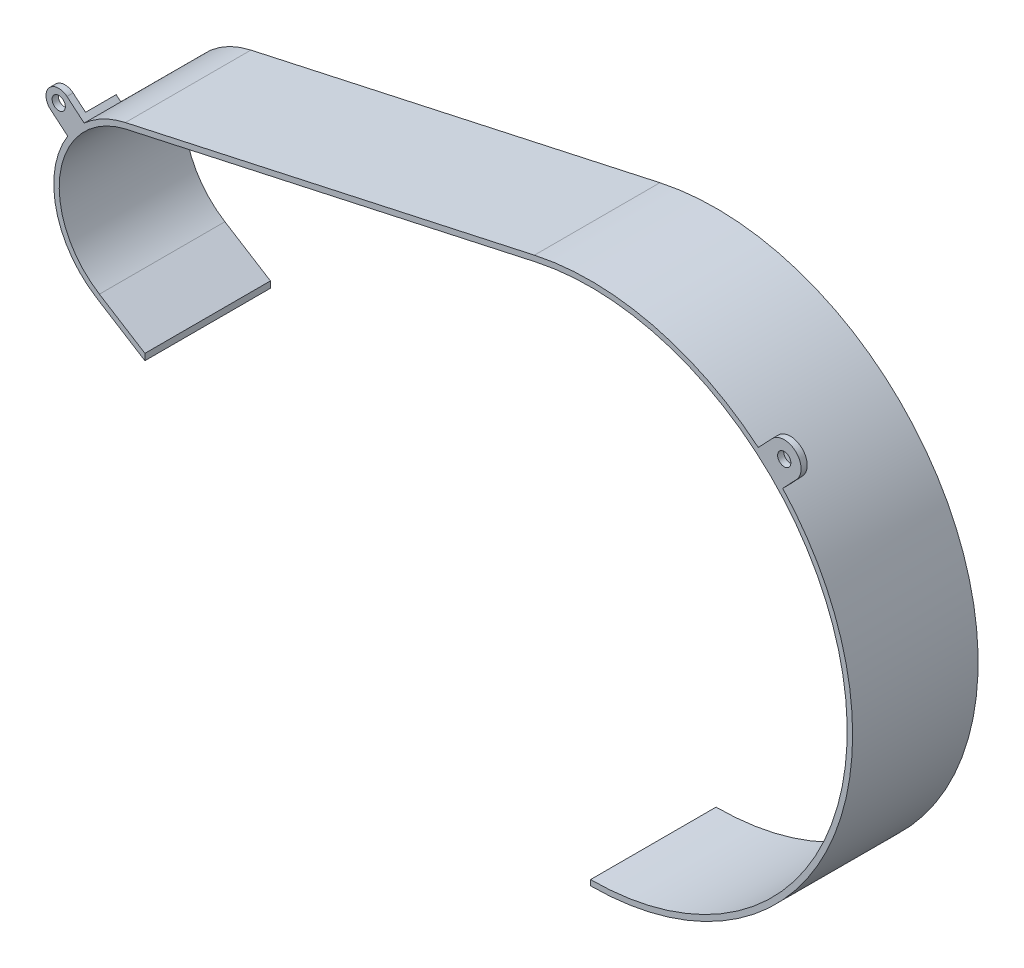
ISO-10303-21;
HEADER;
FILE_DESCRIPTION(('STEP AP214'),'2;1');
FILE_NAME('part.step','',(''),(''),'','','');
FILE_SCHEMA(('AUTOMOTIVE_DESIGN { 1 0 10303 214 1 1 1 1 }'));
ENDSEC;
DATA;
#1=APPLICATION_CONTEXT('core data for automotive mechanical design processes');
#2=APPLICATION_PROTOCOL_DEFINITION('international standard','automotive_design',2000,#1);
#3=PRODUCT_CONTEXT('',#1,'mechanical');
#4=PRODUCT('Part','Part','',(#3));
#5=PRODUCT_RELATED_PRODUCT_CATEGORY('part','',(#4));
#6=PRODUCT_DEFINITION_FORMATION('','',#4);
#7=PRODUCT_DEFINITION_CONTEXT('part definition',#1,'design');
#8=PRODUCT_DEFINITION('design','',#6,#7);
#9=PRODUCT_DEFINITION_SHAPE('','',#8);
#10=(LENGTH_UNIT() NAMED_UNIT(*) SI_UNIT(.MILLI.,.METRE.));
#11=(NAMED_UNIT(*) PLANE_ANGLE_UNIT() SI_UNIT($,.RADIAN.));
#12=(NAMED_UNIT(*) SI_UNIT($,.STERADIAN.) SOLID_ANGLE_UNIT());
#13=UNCERTAINTY_MEASURE_WITH_UNIT(LENGTH_MEASURE(1.E-05),#10,'distance_accuracy_value','');
#14=(GEOMETRIC_REPRESENTATION_CONTEXT(3) GLOBAL_UNCERTAINTY_ASSIGNED_CONTEXT((#13)) GLOBAL_UNIT_ASSIGNED_CONTEXT((#10,
#11,#12)) REPRESENTATION_CONTEXT('',''));
#15=CARTESIAN_POINT('',(0.,0.,0.));
#16=DIRECTION('',(0.,0.,1.));
#17=DIRECTION('',(1.,0.,0.));
#18=AXIS2_PLACEMENT_3D('',#15,#16,#17);
#19=CARTESIAN_POINT('',(-0.694427294768429,68.7178075815896,529.756425293195));
#20=DIRECTION('',(0.,0.,-1.));
#21=DIRECTION('',(-1.,0.,0.));
#22=AXIS2_PLACEMENT_3D('',#19,#20,#21);
#23=CYLINDRICAL_SURFACE('',#22,44.6599999999996);
#24=CARTESIAN_POINT('',(-0.694427294768429,68.7178075815896,43.5));
#25=DIRECTION('',(0.,0.,-1.));
#26=DIRECTION('',(-1.,0.,0.));
#27=AXIS2_PLACEMENT_3D('',#24,#25,#26);
#28=CIRCLE('',#27,44.6599999999996);
#29=CARTESIAN_POINT('',(-38.5377536434611,92.4327448757574,43.5));
#30=VERTEX_POINT('',#29);
#31=CARTESIAN_POINT('',(-30.4831205853251,101.991661461793,43.5));
#32=VERTEX_POINT('',#31);
#33=EDGE_CURVE('E11',#30,#32,#28,.T.);
#34=ORIENTED_EDGE('',*,*,#33,.T.);
#35=DIRECTION('',(0.,0.,1.));
#36=VECTOR('',#35,1.);
#37=CARTESIAN_POINT('',(-30.4831205853251,101.991661461793,58.5));
#38=LINE('',#37,#36);
#39=CARTESIAN_POINT('',(-30.4831205853251,101.991661461793,61.5));
#40=VERTEX_POINT('',#39);
#41=EDGE_CURVE('E255',#32,#40,#38,.T.);
#42=ORIENTED_EDGE('',*,*,#41,.T.);
#43=CARTESIAN_POINT('',(-0.694427294768429,68.7178075815896,61.5));
#44=DIRECTION('',(0.,0.,1.));
#45=DIRECTION('',(1.,0.,0.));
#46=AXIS2_PLACEMENT_3D('',#43,#44,#45);
#47=CIRCLE('',#46,44.6599999999996);
#48=CARTESIAN_POINT('',(-10.2551318329405,112.342439714525,61.5));
#49=VERTEX_POINT('',#48);
#50=EDGE_CURVE('E289',#49,#40,#47,.T.);
#51=ORIENTED_EDGE('',*,*,#50,.F.);
#52=DIRECTION('',(0.,0.,-1.));
#53=VECTOR('',#52,1.);
#54=CARTESIAN_POINT('',(-10.2551318329405,112.342439714525,529.756425293195));
#55=LINE('',#54,#53);
#56=CARTESIAN_POINT('',(-10.2551318329405,112.342439714525,0.));
#57=VERTEX_POINT('',#56);
#58=EDGE_CURVE('E330',#49,#57,#55,.T.);
#59=ORIENTED_EDGE('',*,*,#58,.T.);
#60=CARTESIAN_POINT('',(-0.694427294768429,68.7178075815896,0.));
#61=DIRECTION('',(0.,0.,1.));
#62=DIRECTION('',(1.,0.,0.));
#63=AXIS2_PLACEMENT_3D('',#60,#61,#62);
#64=CIRCLE('',#63,44.6599999999996);
#65=CARTESIAN_POINT('',(-24.4006210858876,30.8690034269288,0.));
#66=VERTEX_POINT('',#65);
#67=EDGE_CURVE('E322',#57,#66,#64,.T.);
#68=ORIENTED_EDGE('',*,*,#67,.T.);
#69=DIRECTION('',(0.,0.,-1.));
#70=VECTOR('',#69,1.);
#71=CARTESIAN_POINT('',(-24.4006210858876,30.8690034269288,529.756425293195));
#72=LINE('',#71,#70);
#73=CARTESIAN_POINT('',(-24.4006210858876,30.8690034269288,61.5));
#74=VERTEX_POINT('',#73);
#75=EDGE_CURVE('E328',#74,#66,#72,.T.);
#76=ORIENTED_EDGE('',*,*,#75,.F.);
#77=CARTESIAN_POINT('',(-38.5377536434611,92.4327448757574,61.5));
#78=VERTEX_POINT('',#77);
#79=EDGE_CURVE('E288',#78,#74,#47,.T.);
#80=ORIENTED_EDGE('',*,*,#79,.F.);
#81=DIRECTION('',(0.,0.,1.));
#82=VECTOR('',#81,1.);
#83=CARTESIAN_POINT('',(-38.5377536434611,92.4327448757574,58.5));
#84=LINE('',#83,#82);
#85=EDGE_CURVE('E258',#30,#78,#84,.T.);
#86=ORIENTED_EDGE('',*,*,#85,.F.);
#87=EDGE_LOOP('',(#34,#42,#51,#59,#68,#76,#80,#86));
#88=FACE_BOUND('',#87,.T.);
#89=ADVANCED_FACE('F37',(#88),#23,.T.);
#90=CARTESIAN_POINT('',(-42.9201771884048,104.298505240855,58.5));
#91=DIRECTION('',(0.,0.,-1.));
#92=DIRECTION('',(-1.,0.,0.));
#93=AXIS2_PLACEMENT_3D('',#90,#91,#92);
#94=PLANE('',#93);
#95=CARTESIAN_POINT('',(-42.9201771884048,104.298505240855,58.5));
#96=DIRECTION('',(0.,0.,1.));
#97=DIRECTION('',(1.,0.,0.));
#98=AXIS2_PLACEMENT_3D('',#95,#96,#97);
#99=CIRCLE('',#98,3.24999999999824);
#100=CARTESIAN_POINT('',(-39.6701771884066,104.298505240855,58.5));
#101=VERTEX_POINT('',#100);
#102=EDGE_CURVE('E230',#101,#101,#99,.T.);
#103=ORIENTED_EDGE('',*,*,#102,.T.);
#104=EDGE_LOOP('',(#103));
#105=FACE_BOUND('',#104,.T.);
#106=DIRECTION('',(-0.764713326882831,0.644370644650881,0.));
#107=VECTOR('',#106,1.);
#108=CARTESIAN_POINT('',(-38.8928606593368,109.077963533873,58.5));
#109=LINE('',#108,#107);
#110=CARTESIAN_POINT('',(-32.7772605659736,103.924773395745,58.5));
#111=VERTEX_POINT('',#110);
#112=CARTESIAN_POINT('',(-38.8928606593368,109.077963533873,58.5));
#113=VERTEX_POINT('',#112);
#114=EDGE_CURVE('E243',#111,#113,#109,.T.);
#115=ORIENTED_EDGE('',*,*,#114,.F.);
#116=DIRECTION('',(0.644370644650882,0.764713326882831,0.));
#117=VECTOR('',#116,1.);
#118=CARTESIAN_POINT('',(-32.7772605659736,103.924773395745,58.5));
#119=LINE('',#118,#117);
#120=CARTESIAN_POINT('',(-40.8318936241096,94.3658568097101,58.5));
#121=VERTEX_POINT('',#120);
#122=EDGE_CURVE('E212',#121,#111,#119,.T.);
#123=ORIENTED_EDGE('',*,*,#122,.F.);
#124=DIRECTION('',(0.764713326882831,-0.644370644650881,0.));
#125=VECTOR('',#124,1.);
#126=CARTESIAN_POINT('',(-46.9474937174728,99.5190469478378,58.5));
#127=LINE('',#126,#125);
#128=CARTESIAN_POINT('',(-46.9474937174728,99.5190469478378,58.5));
#129=VERTEX_POINT('',#128);
#130=EDGE_CURVE('E239',#129,#121,#127,.T.);
#131=ORIENTED_EDGE('',*,*,#130,.F.);
#132=CARTESIAN_POINT('',(-42.9201771884048,104.298505240855,58.5));
#133=DIRECTION('',(0.,0.,1.));
#134=DIRECTION('',(-1.,0.,0.));
#135=AXIS2_PLACEMENT_3D('',#132,#133,#134);
#136=CIRCLE('',#135,6.25);
#137=EDGE_CURVE('E236',#113,#129,#136,.T.);
#138=ORIENTED_EDGE('',*,*,#137,.F.);
#139=EDGE_LOOP('',(#115,#123,#131,#138));
#140=FACE_BOUND('',#139,.T.);
#141=ADVANCED_FACE('F392',(#105,#140),#94,.T.);
#142=CARTESIAN_POINT('',(-24.4006210858867,30.8690034269303,529.756425293195));
#143=DIRECTION('',(0.530814907996407,0.847487777757748,0.));
#144=DIRECTION('',(-0.847487777757748,0.530814907996407,0.));
#145=AXIS2_PLACEMENT_3D('',#142,#143,#144);
#146=PLANE('',#145);
#147=DIRECTION('',(0.,0.,-1.));
#148=VECTOR('',#147,1.);
#149=CARTESIAN_POINT('',(-0.694427294768426,16.0208824198396,529.756425293195));
#150=LINE('',#149,#148);
#151=CARTESIAN_POINT('',(-0.694427294768425,16.0208824198396,61.5));
#152=VERTEX_POINT('',#151);
#153=CARTESIAN_POINT('',(-0.694427294768425,16.0208824198396,0.));
#154=VERTEX_POINT('',#153);
#155=EDGE_CURVE('E275',#152,#154,#150,.T.);
#156=ORIENTED_EDGE('',*,*,#155,.F.);
#157=DIRECTION('',(0.847487777757748,-0.530814907996407,0.));
#158=VECTOR('',#157,1.);
#159=CARTESIAN_POINT('',(-24.4006210858867,30.8690034269303,61.5));
#160=LINE('',#159,#158);
#161=EDGE_CURVE('E285',#74,#152,#160,.T.);
#162=ORIENTED_EDGE('',*,*,#161,.F.);
#163=ORIENTED_EDGE('',*,*,#75,.T.);
#164=DIRECTION('',(0.847487777757748,-0.530814907996407,0.));
#165=VECTOR('',#164,1.);
#166=CARTESIAN_POINT('',(-24.4006210858867,30.8690034269303,0.));
#167=LINE('',#166,#165);
#168=EDGE_CURVE('E325',#66,#154,#167,.T.);
#169=ORIENTED_EDGE('',*,*,#168,.T.);
#170=EDGE_LOOP('',(#156,#162,#163,#169));
#171=FACE_BOUND('',#170,.T.);
#172=ADVANCED_FACE('F398',(#171),#146,.F.);
#173=CARTESIAN_POINT('',(217.691145796741,30.8015134135153,0.));
#174=DIRECTION('',(0.,0.,1.));
#175=DIRECTION('',(1.,0.,0.));
#176=AXIS2_PLACEMENT_3D('',#173,#174,#175);
#177=PLANE('',#176);
#178=DIRECTION('',(0.,1.,0.));
#179=VECTOR('',#178,1.);
#180=CARTESIAN_POINT('',(-0.694427294768425,0.,0.));
#181=LINE('',#180,#179);
#182=CARTESIAN_POINT('',(-0.694427294768423,19.1595707523577,0.));
#183=VERTEX_POINT('',#182);
#184=EDGE_CURVE('E262',#154,#183,#181,.T.);
#185=ORIENTED_EDGE('',*,*,#184,.F.);
#186=ORIENTED_EDGE('',*,*,#168,.F.);
#187=ORIENTED_EDGE('',*,*,#67,.F.);
#188=DIRECTION('',(-0.976816662179428,-0.214077575865951,0.));
#189=VECTOR('',#188,1.);
#190=CARTESIAN_POINT('',(190.193154767259,156.272365301699,0.));
#191=LINE('',#190,#189);
#192=CARTESIAN_POINT('',(190.193154767259,156.272365301699,0.));
#193=VERTEX_POINT('',#192);
#194=EDGE_CURVE('E319',#193,#57,#191,.T.);
#195=ORIENTED_EDGE('',*,*,#194,.F.);
#196=CARTESIAN_POINT('',(217.691145796741,30.8015134135153,0.));
#197=DIRECTION('',(0.,0.,1.));
#198=DIRECTION('',(1.,0.,0.));
#199=AXIS2_PLACEMENT_3D('',#196,#197,#198);
#200=CIRCLE('',#199,128.448722003);
#201=CARTESIAN_POINT('',(217.69114570248,-97.6472085894842,0.));
#202=VERTEX_POINT('',#201);
#203=EDGE_CURVE('E317',#202,#193,#200,.T.);
#204=ORIENTED_EDGE('',*,*,#203,.F.);
#205=DIRECTION('',(0.,1.,0.));
#206=VECTOR('',#205,1.);
#207=CARTESIAN_POINT('',(217.69114570248,0.,0.));
#208=LINE('',#207,#206);
#209=CARTESIAN_POINT('',(217.69114570248,-94.9872085894843,0.));
#210=VERTEX_POINT('',#209);
#211=EDGE_CURVE('E264',#202,#210,#208,.T.);
#212=ORIENTED_EDGE('',*,*,#211,.T.);
#213=CARTESIAN_POINT('',(217.691145796741,30.8015134135153,0.));
#214=DIRECTION('',(0.,0.,1.));
#215=DIRECTION('',(1.,0.,0.));
#216=AXIS2_PLACEMENT_3D('',#213,#214,#215);
#217=CIRCLE('',#216,125.788722003);
#218=CARTESIAN_POINT('',(190.762601119062,153.674032980301,0.));
#219=VERTEX_POINT('',#218);
#220=EDGE_CURVE('E305',#210,#219,#217,.T.);
#221=ORIENTED_EDGE('',*,*,#220,.T.);
#222=DIRECTION('',(-0.976816662179428,-0.214077575865951,0.));
#223=VECTOR('',#222,1.);
#224=CARTESIAN_POINT('',(190.762601119062,153.674032980301,0.));
#225=LINE('',#224,#223);
#226=CARTESIAN_POINT('',(-9.68568548113702,109.744107393127,0.));
#227=VERTEX_POINT('',#226);
#228=EDGE_CURVE('E307',#219,#227,#225,.T.);
#229=ORIENTED_EDGE('',*,*,#228,.T.);
#230=CARTESIAN_POINT('',(-0.694427294768429,68.7178075815896,0.));
#231=DIRECTION('',(0.,0.,1.));
#232=DIRECTION('',(1.,0.,0.));
#233=AXIS2_PLACEMENT_3D('',#230,#231,#232);
#234=CIRCLE('',#233,41.9999999999996);
#235=CARTESIAN_POINT('',(-22.9886534306162,33.1233209157659,0.));
#236=VERTEX_POINT('',#235);
#237=EDGE_CURVE('E299',#227,#236,#234,.T.);
#238=ORIENTED_EDGE('',*,*,#237,.T.);
#239=DIRECTION('',(0.847487777757748,-0.530814907996407,0.));
#240=VECTOR('',#239,1.);
#241=CARTESIAN_POINT('',(-22.9886534306162,33.1233209157659,0.));
#242=LINE('',#241,#240);
#243=EDGE_CURVE('E302',#236,#183,#242,.T.);
#244=ORIENTED_EDGE('',*,*,#243,.T.);
#245=EDGE_LOOP('',(#185,#186,#187,#195,#204,#212,#221,#229,#238,#244));
#246=FACE_BOUND('',#245,.T.);
#247=ADVANCED_FACE('F368',(#246),#177,.F.);
#248=CARTESIAN_POINT('',(-22.9886534306162,33.1233209157659,529.756425293195));
#249=DIRECTION('',(0.530814907996407,0.847487777757748,0.));
#250=DIRECTION('',(-0.847487777757748,0.530814907996407,0.));
#251=AXIS2_PLACEMENT_3D('',#248,#249,#250);
#252=PLANE('',#251);
#253=DIRECTION('',(0.847487777757748,-0.530814907996407,0.));
#254=VECTOR('',#253,1.);
#255=CARTESIAN_POINT('',(-22.9886534306162,33.1233209157659,61.5));
#256=LINE('',#255,#254);
#257=CARTESIAN_POINT('',(-22.9886534306162,33.1233209157659,61.5));
#258=VERTEX_POINT('',#257);
#259=CARTESIAN_POINT('',(-0.694427294768423,19.1595707523577,61.5));
#260=VERTEX_POINT('',#259);
#261=EDGE_CURVE('E279',#258,#260,#256,.T.);
#262=ORIENTED_EDGE('',*,*,#261,.T.);
#263=DIRECTION('',(0.,0.,-1.));
#264=VECTOR('',#263,1.);
#265=CARTESIAN_POINT('',(-0.694427294768426,19.1595707523577,529.756425293195));
#266=LINE('',#265,#264);
#267=EDGE_CURVE('E272',#260,#183,#266,.T.);
#268=ORIENTED_EDGE('',*,*,#267,.T.);
#269=ORIENTED_EDGE('',*,*,#243,.F.);
#270=DIRECTION('',(0.,0.,-1.));
#271=VECTOR('',#270,1.);
#272=CARTESIAN_POINT('',(-22.9886534306162,33.1233209157659,529.756425293195));
#273=LINE('',#272,#271);
#274=EDGE_CURVE('E315',#258,#236,#273,.T.);
#275=ORIENTED_EDGE('',*,*,#274,.F.);
#276=EDGE_LOOP('',(#262,#268,#269,#275));
#277=FACE_BOUND('',#276,.T.);
#278=ADVANCED_FACE('F345',(#277),#252,.T.);
#279=CARTESIAN_POINT('',(0.,0.,61.5));
#280=DIRECTION('',(0.,0.,1.));
#281=DIRECTION('',(1.,0.,0.));
#282=AXIS2_PLACEMENT_3D('',#279,#280,#281);
#283=PLANE('',#282);
#284=ORIENTED_EDGE('',*,*,#161,.T.);
#285=DIRECTION('',(0.,1.,0.));
#286=VECTOR('',#285,1.);
#287=CARTESIAN_POINT('',(-0.694427294768425,0.,61.5));
#288=LINE('',#287,#286);
#289=EDGE_CURVE('E45',#152,#260,#288,.T.);
#290=ORIENTED_EDGE('',*,*,#289,.T.);
#291=ORIENTED_EDGE('',*,*,#261,.F.);
#292=CARTESIAN_POINT('',(-0.694427294768429,68.7178075815896,61.5));
#293=DIRECTION('',(0.,0.,1.));
#294=DIRECTION('',(1.,0.,0.));
#295=AXIS2_PLACEMENT_3D('',#292,#293,#294);
#296=CIRCLE('',#295,41.9999999999996);
#297=CARTESIAN_POINT('',(-9.68568548113701,109.744107393127,61.5));
#298=VERTEX_POINT('',#297);
#299=EDGE_CURVE('E282',#298,#258,#296,.T.);
#300=ORIENTED_EDGE('',*,*,#299,.F.);
#301=DIRECTION('',(-0.976816662179428,-0.214077575865951,0.));
#302=VECTOR('',#301,1.);
#303=CARTESIAN_POINT('',(190.762601119062,153.674032980301,61.5));
#304=LINE('',#303,#302);
#305=CARTESIAN_POINT('',(190.762601119062,153.674032980301,61.5));
#306=VERTEX_POINT('',#305);
#307=EDGE_CURVE('E335',#306,#298,#304,.T.);
#308=ORIENTED_EDGE('',*,*,#307,.F.);
#309=CARTESIAN_POINT('',(217.691145796741,30.8015134135153,61.5));
#310=DIRECTION('',(0.,0.,1.));
#311=DIRECTION('',(1.,0.,0.));
#312=AXIS2_PLACEMENT_3D('',#309,#310,#311);
#313=CIRCLE('',#312,125.788722003);
#314=CARTESIAN_POINT('',(217.69114570248,-94.9872085894843,61.5));
#315=VERTEX_POINT('',#314);
#316=EDGE_CURVE('E277',#315,#306,#313,.T.);
#317=ORIENTED_EDGE('',*,*,#316,.F.);
#318=DIRECTION('',(0.,1.,0.));
#319=VECTOR('',#318,1.);
#320=CARTESIAN_POINT('',(217.69114570248,0.,61.5));
#321=LINE('',#320,#319);
#322=CARTESIAN_POINT('',(217.691145796741,-97.6472085894842,61.5));
#323=VERTEX_POINT('',#322);
#324=EDGE_CURVE('E254',#323,#315,#321,.T.);
#325=ORIENTED_EDGE('',*,*,#324,.F.);
#326=CARTESIAN_POINT('',(217.691145796741,30.8015134135153,61.5));
#327=DIRECTION('',(0.,0.,1.));
#328=DIRECTION('',(1.,0.,0.));
#329=AXIS2_PLACEMENT_3D('',#326,#327,#328);
#330=CIRCLE('',#329,128.448722003);
#331=CARTESIAN_POINT('',(311.872256716726,118.14561756532,61.5));
#332=VERTEX_POINT('',#331);
#333=EDGE_CURVE('E296',#323,#332,#330,.T.);
#334=ORIENTED_EDGE('',*,*,#333,.T.);
#335=DIRECTION('',(0.688031109185273,0.725681192255444,0.));
#336=VECTOR('',#335,1.);
#337=CARTESIAN_POINT('',(318.602174801604,125.243806752432,61.5));
#338=LINE('',#337,#336);
#339=CARTESIAN_POINT('',(318.602174801604,125.243806752432,61.5));
#340=VERTEX_POINT('',#339);
#341=EDGE_CURVE('E197',#332,#340,#338,.T.);
#342=ORIENTED_EDGE('',*,*,#341,.T.);
#343=CARTESIAN_POINT('',(312.615304965498,130.92006340321,61.5));
#344=DIRECTION('',(0.,0.,1.));
#345=DIRECTION('',(-1.,0.,0.));
#346=AXIS2_PLACEMENT_3D('',#343,#344,#345);
#347=CIRCLE('',#346,8.24999999999829);
#348=CARTESIAN_POINT('',(306.628435129392,136.596320053987,61.5));
#349=VERTEX_POINT('',#348);
#350=EDGE_CURVE('E207',#340,#349,#347,.T.);
#351=ORIENTED_EDGE('',*,*,#350,.T.);
#352=DIRECTION('',(-0.688031109185261,-0.725681192255455,0.));
#353=VECTOR('',#352,1.);
#354=CARTESIAN_POINT('',(306.628435129392,136.596320053987,61.5));
#355=LINE('',#354,#353);
#356=CARTESIAN_POINT('',(299.898517044514,129.498130866874,61.5));
#357=VERTEX_POINT('',#356);
#358=EDGE_CURVE('E52',#349,#357,#355,.T.);
#359=ORIENTED_EDGE('',*,*,#358,.T.);
#360=CARTESIAN_POINT('',(190.193154767259,156.272365301699,61.5));
#361=VERTEX_POINT('',#360);
#362=EDGE_CURVE('E295',#357,#361,#330,.T.);
#363=ORIENTED_EDGE('',*,*,#362,.T.);
#364=DIRECTION('',(-0.976816662179428,-0.214077575865951,0.));
#365=VECTOR('',#364,1.);
#366=CARTESIAN_POINT('',(190.193154767259,156.272365301699,61.5));
#367=LINE('',#366,#365);
#368=EDGE_CURVE('E292',#361,#49,#367,.T.);
#369=ORIENTED_EDGE('',*,*,#368,.T.);
#370=ORIENTED_EDGE('',*,*,#50,.T.);
#371=DIRECTION('',(-0.764713326882831,0.644370644650881,0.));
#372=VECTOR('',#371,1.);
#373=CARTESIAN_POINT('',(-38.8928606593368,109.077963533873,61.5));
#374=LINE('',#373,#372);
#375=CARTESIAN_POINT('',(-38.8928606593368,109.077963533873,61.5));
#376=VERTEX_POINT('',#375);
#377=EDGE_CURVE('E240',#40,#376,#374,.T.);
#378=ORIENTED_EDGE('',*,*,#377,.T.);
#379=CARTESIAN_POINT('',(-42.9201771884048,104.298505240855,61.5));
#380=DIRECTION('',(0.,0.,1.));
#381=DIRECTION('',(-1.,0.,0.));
#382=AXIS2_PLACEMENT_3D('',#379,#380,#381);
#383=CIRCLE('',#382,6.25);
#384=CARTESIAN_POINT('',(-46.9474937174728,99.5190469478378,61.5));
#385=VERTEX_POINT('',#384);
#386=EDGE_CURVE('E233',#376,#385,#383,.T.);
#387=ORIENTED_EDGE('',*,*,#386,.T.);
#388=DIRECTION('',(0.764713326882831,-0.644370644650881,0.));
#389=VECTOR('',#388,1.);
#390=CARTESIAN_POINT('',(-46.9474937174728,99.5190469478378,61.5));
#391=LINE('',#390,#389);
#392=EDGE_CURVE('E248',#385,#78,#391,.T.);
#393=ORIENTED_EDGE('',*,*,#392,.T.);
#394=ORIENTED_EDGE('',*,*,#79,.T.);
#395=EDGE_LOOP('',(#284,#290,#291,#300,#308,#317,#325,#334,#342,#351,#359,#363,#369,#370,#378,
#387,#393,#394));
#396=FACE_BOUND('',#395,.T.);
#397=CARTESIAN_POINT('',(-42.9201771884048,104.298505240855,61.5));
#398=DIRECTION('',(0.,0.,1.));
#399=DIRECTION('',(1.,0.,0.));
#400=AXIS2_PLACEMENT_3D('',#397,#398,#399);
#401=CIRCLE('',#400,3.24999999999824);
#402=CARTESIAN_POINT('',(-39.6701771884066,104.298505240855,61.5));
#403=VERTEX_POINT('',#402);
#404=EDGE_CURVE('E229',#403,#403,#401,.T.);
#405=ORIENTED_EDGE('',*,*,#404,.F.);
#406=EDGE_LOOP('',(#405));
#407=FACE_BOUND('',#406,.T.);
#408=CARTESIAN_POINT('',(312.615304965498,130.92006340321,61.5));
#409=DIRECTION('',(0.,0.,1.));
#410=DIRECTION('',(1.,0.,0.));
#411=AXIS2_PLACEMENT_3D('',#408,#409,#410);
#412=CIRCLE('',#411,3.24999999999827);
#413=CARTESIAN_POINT('',(315.865304965496,130.92006340321,61.5));
#414=VERTEX_POINT('',#413);
#415=EDGE_CURVE('E202',#414,#414,#412,.T.);
#416=ORIENTED_EDGE('',*,*,#415,.F.);
#417=EDGE_LOOP('',(#416));
#418=FACE_BOUND('',#417,.T.);
#419=ADVANCED_FACE('F338',(#396,#407,#418),#283,.T.);
#420=CARTESIAN_POINT('',(190.193154767259,156.272365301699,529.756425293195));
#421=DIRECTION('',(0.214077575865951,-0.976816662179428,0.));
#422=DIRECTION('',(0.976816662179428,0.214077575865951,0.));
#423=AXIS2_PLACEMENT_3D('',#420,#421,#422);
#424=PLANE('',#423);
#425=ORIENTED_EDGE('',*,*,#368,.F.);
#426=DIRECTION('',(0.,0.,-1.));
#427=VECTOR('',#426,1.);
#428=CARTESIAN_POINT('',(190.193154767259,156.272365301699,529.756425293195));
#429=LINE('',#428,#427);
#430=EDGE_CURVE('E332',#361,#193,#429,.T.);
#431=ORIENTED_EDGE('',*,*,#430,.T.);
#432=ORIENTED_EDGE('',*,*,#194,.T.);
#433=ORIENTED_EDGE('',*,*,#58,.F.);
#434=EDGE_LOOP('',(#425,#431,#432,#433));
#435=FACE_BOUND('',#434,.T.);
#436=ADVANCED_FACE('F377',(#435),#424,.F.);
#437=CARTESIAN_POINT('',(217.691145796741,30.8015134135153,529.756425293195));
#438=DIRECTION('',(0.,0.,-1.));
#439=DIRECTION('',(-1.,0.,0.));
#440=AXIS2_PLACEMENT_3D('',#437,#438,#439);
#441=CYLINDRICAL_SURFACE('',#440,128.448722003);
#442=CARTESIAN_POINT('',(217.691145796741,30.8015134135153,58.5));
#443=DIRECTION('',(0.,0.,-1.));
#444=DIRECTION('',(-1.,0.,0.));
#445=AXIS2_PLACEMENT_3D('',#442,#443,#444);
#446=CIRCLE('',#445,128.448722003);
#447=CARTESIAN_POINT('',(299.898517044514,129.498130866874,58.5));
#448=VERTEX_POINT('',#447);
#449=CARTESIAN_POINT('',(311.872256716726,118.14561756532,58.5));
#450=VERTEX_POINT('',#449);
#451=EDGE_CURVE('E193',#448,#450,#446,.T.);
#452=ORIENTED_EDGE('',*,*,#451,.T.);
#453=DIRECTION('',(0.,0.,1.));
#454=VECTOR('',#453,1.);
#455=CARTESIAN_POINT('',(311.872256716726,118.14561756532,58.5));
#456=LINE('',#455,#454);
#457=EDGE_CURVE('E213',#450,#332,#456,.T.);
#458=ORIENTED_EDGE('',*,*,#457,.T.);
#459=ORIENTED_EDGE('',*,*,#333,.F.);
#460=DIRECTION('',(0.,0.,1.));
#461=VECTOR('',#460,1.);
#462=CARTESIAN_POINT('',(217.69114570248,-97.6472085894842,0.));
#463=LINE('',#462,#461);
#464=EDGE_CURVE('E267',#202,#323,#463,.T.);
#465=ORIENTED_EDGE('',*,*,#464,.F.);
#466=ORIENTED_EDGE('',*,*,#203,.T.);
#467=ORIENTED_EDGE('',*,*,#430,.F.);
#468=ORIENTED_EDGE('',*,*,#362,.F.);
#469=DIRECTION('',(0.,0.,1.));
#470=VECTOR('',#469,1.);
#471=CARTESIAN_POINT('',(299.898517044514,129.498130866874,58.5));
#472=LINE('',#471,#470);
#473=EDGE_CURVE('E183',#448,#357,#472,.T.);
#474=ORIENTED_EDGE('',*,*,#473,.F.);
#475=EDGE_LOOP('',(#452,#458,#459,#465,#466,#467,#468,#474));
#476=FACE_BOUND('',#475,.T.);
#477=ADVANCED_FACE('F39',(#476),#441,.T.);
#478=CARTESIAN_POINT('',(190.762601119062,153.674032980301,529.756425293195));
#479=DIRECTION('',(0.214077575865951,-0.976816662179428,0.));
#480=DIRECTION('',(0.976816662179428,0.214077575865951,0.));
#481=AXIS2_PLACEMENT_3D('',#478,#479,#480);
#482=PLANE('',#481);
#483=DIRECTION('',(0.,0.,-1.));
#484=VECTOR('',#483,1.);
#485=CARTESIAN_POINT('',(190.762601119062,153.674032980301,529.756425293195));
#486=LINE('',#485,#484);
#487=EDGE_CURVE('E312',#306,#219,#486,.T.);
#488=ORIENTED_EDGE('',*,*,#487,.F.);
#489=ORIENTED_EDGE('',*,*,#307,.T.);
#490=DIRECTION('',(0.,0.,-1.));
#491=VECTOR('',#490,1.);
#492=CARTESIAN_POINT('',(-9.68568548113701,109.744107393127,529.756425293195));
#493=LINE('',#492,#491);
#494=EDGE_CURVE('E310',#298,#227,#493,.T.);
#495=ORIENTED_EDGE('',*,*,#494,.T.);
#496=ORIENTED_EDGE('',*,*,#228,.F.);
#497=EDGE_LOOP('',(#488,#489,#495,#496));
#498=FACE_BOUND('',#497,.T.);
#499=ADVANCED_FACE('F357',(#498),#482,.T.);
#500=CARTESIAN_POINT('',(217.691145796741,30.8015134135153,529.756425293195));
#501=DIRECTION('',(0.,0.,-1.));
#502=DIRECTION('',(-1.,0.,0.));
#503=AXIS2_PLACEMENT_3D('',#500,#501,#502);
#504=CYLINDRICAL_SURFACE('',#503,125.788722003);
#505=DIRECTION('',(0.,0.,-1.));
#506=VECTOR('',#505,1.);
#507=CARTESIAN_POINT('',(217.69114570248,-94.9872085894843,529.756425293195));
#508=LINE('',#507,#506);
#509=EDGE_CURVE('E270',#315,#210,#508,.T.);
#510=ORIENTED_EDGE('',*,*,#509,.F.);
#511=ORIENTED_EDGE('',*,*,#316,.T.);
#512=ORIENTED_EDGE('',*,*,#487,.T.);
#513=ORIENTED_EDGE('',*,*,#220,.F.);
#514=EDGE_LOOP('',(#510,#511,#512,#513));
#515=FACE_BOUND('',#514,.T.);
#516=ADVANCED_FACE('F361',(#515),#504,.F.);
#517=CARTESIAN_POINT('',(-0.694427294768429,68.7178075815896,529.756425293195));
#518=DIRECTION('',(0.,0.,-1.));
#519=DIRECTION('',(-1.,0.,0.));
#520=AXIS2_PLACEMENT_3D('',#517,#518,#519);
#521=CYLINDRICAL_SURFACE('',#520,41.9999999999996);
#522=ORIENTED_EDGE('',*,*,#494,.F.);
#523=ORIENTED_EDGE('',*,*,#299,.T.);
#524=ORIENTED_EDGE('',*,*,#274,.T.);
#525=ORIENTED_EDGE('',*,*,#237,.F.);
#526=EDGE_LOOP('',(#522,#523,#524,#525));
#527=FACE_BOUND('',#526,.T.);
#528=ADVANCED_FACE('F350',(#527),#521,.F.);
#529=CARTESIAN_POINT('',(217.69114570248,0.,0.));
#530=DIRECTION('',(1.,0.,0.));
#531=DIRECTION('',(0.,0.,-1.));
#532=AXIS2_PLACEMENT_3D('',#529,#530,#531);
#533=PLANE('',#532);
#534=ORIENTED_EDGE('',*,*,#509,.T.);
#535=ORIENTED_EDGE('',*,*,#211,.F.);
#536=ORIENTED_EDGE('',*,*,#464,.T.);
#537=ORIENTED_EDGE('',*,*,#324,.T.);
#538=EDGE_LOOP('',(#534,#535,#536,#537));
#539=FACE_BOUND('',#538,.T.);
#540=ADVANCED_FACE('F363',(#539),#533,.F.);
#541=CARTESIAN_POINT('',(-0.694427294768425,0.,0.));
#542=DIRECTION('',(1.,0.,0.));
#543=DIRECTION('',(0.,1.,0.));
#544=AXIS2_PLACEMENT_3D('',#541,#542,#543);
#545=PLANE('',#544);
#546=ORIENTED_EDGE('',*,*,#155,.T.);
#547=ORIENTED_EDGE('',*,*,#184,.T.);
#548=ORIENTED_EDGE('',*,*,#267,.F.);
#549=ORIENTED_EDGE('',*,*,#289,.F.);
#550=EDGE_LOOP('',(#546,#547,#548,#549));
#551=FACE_BOUND('',#550,.T.);
#552=ADVANCED_FACE('F415',(#551),#545,.T.);
#553=CARTESIAN_POINT('',(-42.9201771884048,104.298505240855,58.5));
#554=DIRECTION('',(0.,0.,1.));
#555=DIRECTION('',(1.,0.,0.));
#556=AXIS2_PLACEMENT_3D('',#553,#554,#555);
#557=CYLINDRICAL_SURFACE('',#556,6.25);
#558=ORIENTED_EDGE('',*,*,#386,.F.);
#559=DIRECTION('',(0.,0.,1.));
#560=VECTOR('',#559,1.);
#561=CARTESIAN_POINT('',(-38.8928606593368,109.077963533873,58.5));
#562=LINE('',#561,#560);
#563=EDGE_CURVE('E252',#113,#376,#562,.T.);
#564=ORIENTED_EDGE('',*,*,#563,.F.);
#565=ORIENTED_EDGE('',*,*,#137,.T.);
#566=DIRECTION('',(0.,0.,1.));
#567=VECTOR('',#566,1.);
#568=CARTESIAN_POINT('',(-46.9474937174728,99.5190469478378,58.5));
#569=LINE('',#568,#567);
#570=EDGE_CURVE('E245',#129,#385,#569,.T.);
#571=ORIENTED_EDGE('',*,*,#570,.T.);
#572=EDGE_LOOP('',(#558,#564,#565,#571));
#573=FACE_BOUND('',#572,.T.);
#574=ADVANCED_FACE('F447',(#573),#557,.T.);
#575=CARTESIAN_POINT('',(-38.8928606593368,109.077963533873,58.5));
#576=DIRECTION('',(0.644370644650882,0.764713326882831,0.));
#577=DIRECTION('',(-0.764713326882831,0.644370644650882,0.));
#578=AXIS2_PLACEMENT_3D('',#575,#576,#577);
#579=PLANE('',#578);
#580=ORIENTED_EDGE('',*,*,#377,.F.);
#581=ORIENTED_EDGE('',*,*,#41,.F.);
#582=DIRECTION('',(0.764713326882832,-0.64437064465088,0.));
#583=VECTOR('',#582,1.);
#584=CARTESIAN_POINT('',(-32.7772605659736,103.924773395745,43.5));
#585=LINE('',#584,#583);
#586=CARTESIAN_POINT('',(-32.7772605659736,103.924773395745,43.5));
#587=VERTEX_POINT('',#586);
#588=EDGE_CURVE('E217',#587,#32,#585,.T.);
#589=ORIENTED_EDGE('',*,*,#588,.F.);
#590=DIRECTION('',(0.,0.,1.));
#591=VECTOR('',#590,1.);
#592=CARTESIAN_POINT('',(-32.7772605659736,103.924773395745,43.5));
#593=LINE('',#592,#591);
#594=EDGE_CURVE('E224',#587,#111,#593,.T.);
#595=ORIENTED_EDGE('',*,*,#594,.T.);
#596=ORIENTED_EDGE('',*,*,#114,.T.);
#597=ORIENTED_EDGE('',*,*,#563,.T.);
#598=EDGE_LOOP('',(#580,#581,#589,#595,#596,#597));
#599=FACE_BOUND('',#598,.T.);
#600=ADVANCED_FACE('F435',(#599),#579,.T.);
#601=CARTESIAN_POINT('',(-46.9474937174728,99.5190469478378,58.5));
#602=DIRECTION('',(-0.644370644650881,-0.764713326882831,0.));
#603=DIRECTION('',(0.764713326882831,-0.644370644650881,0.));
#604=AXIS2_PLACEMENT_3D('',#601,#602,#603);
#605=PLANE('',#604);
#606=ORIENTED_EDGE('',*,*,#392,.F.);
#607=ORIENTED_EDGE('',*,*,#570,.F.);
#608=ORIENTED_EDGE('',*,*,#130,.T.);
#609=DIRECTION('',(0.,0.,1.));
#610=VECTOR('',#609,1.);
#611=CARTESIAN_POINT('',(-40.8318936241096,94.3658568097101,43.5));
#612=LINE('',#611,#610);
#613=CARTESIAN_POINT('',(-40.8318936241096,94.3658568097101,43.5));
#614=VERTEX_POINT('',#613);
#615=EDGE_CURVE('E60',#614,#121,#612,.T.);
#616=ORIENTED_EDGE('',*,*,#615,.F.);
#617=DIRECTION('',(-0.764713326882827,0.644370644650886,0.));
#618=VECTOR('',#617,1.);
#619=CARTESIAN_POINT('',(-38.5377536434611,92.4327448757574,43.5));
#620=LINE('',#619,#618);
#621=EDGE_CURVE('E220',#30,#614,#620,.T.);
#622=ORIENTED_EDGE('',*,*,#621,.F.);
#623=ORIENTED_EDGE('',*,*,#85,.T.);
#624=EDGE_LOOP('',(#606,#607,#608,#616,#622,#623));
#625=FACE_BOUND('',#624,.T.);
#626=ADVANCED_FACE('F450',(#625),#605,.T.);
#627=CARTESIAN_POINT('',(-42.9201771884048,104.298505240855,58.5));
#628=DIRECTION('',(0.,0.,1.));
#629=DIRECTION('',(1.,0.,0.));
#630=AXIS2_PLACEMENT_3D('',#627,#628,#629);
#631=CYLINDRICAL_SURFACE('',#630,3.24999999999824);
#632=ORIENTED_EDGE('',*,*,#102,.F.);
#633=EDGE_LOOP('',(#632));
#634=FACE_BOUND('',#633,.T.);
#635=ORIENTED_EDGE('',*,*,#404,.T.);
#636=EDGE_LOOP('',(#635));
#637=FACE_BOUND('',#636,.T.);
#638=ADVANCED_FACE('F452',(#634,#637),#631,.F.);
#639=CARTESIAN_POINT('',(-32.7772605659736,103.924773395745,43.5));
#640=DIRECTION('',(0.764713326882831,-0.644370644650882,0.));
#641=DIRECTION('',(0.644370644650882,0.764713326882831,0.));
#642=AXIS2_PLACEMENT_3D('',#639,#640,#641);
#643=PLANE('',#642);
#644=ORIENTED_EDGE('',*,*,#122,.T.);
#645=ORIENTED_EDGE('',*,*,#594,.F.);
#646=DIRECTION('',(0.644370644650882,0.764713326882831,0.));
#647=VECTOR('',#646,1.);
#648=CARTESIAN_POINT('',(-32.7772605659736,103.924773395745,43.5));
#649=LINE('',#648,#647);
#650=EDGE_CURVE('E222',#614,#587,#649,.T.);
#651=ORIENTED_EDGE('',*,*,#650,.F.);
#652=ORIENTED_EDGE('',*,*,#615,.T.);
#653=EDGE_LOOP('',(#644,#645,#651,#652));
#654=FACE_BOUND('',#653,.T.);
#655=ADVANCED_FACE('F439',(#654),#643,.F.);
#656=CARTESIAN_POINT('',(0.,0.,43.5));
#657=DIRECTION('',(0.,0.,-1.));
#658=DIRECTION('',(-1.,0.,0.));
#659=AXIS2_PLACEMENT_3D('',#656,#657,#658);
#660=PLANE('',#659);
#661=ORIENTED_EDGE('',*,*,#33,.F.);
#662=ORIENTED_EDGE('',*,*,#621,.T.);
#663=ORIENTED_EDGE('',*,*,#650,.T.);
#664=ORIENTED_EDGE('',*,*,#588,.T.);
#665=EDGE_LOOP('',(#661,#662,#663,#664));
#666=FACE_BOUND('',#665,.T.);
#667=ADVANCED_FACE('F388',(#666),#660,.T.);
#668=CARTESIAN_POINT('',(312.615304965498,130.92006340321,58.5));
#669=DIRECTION('',(0.,0.,1.));
#670=DIRECTION('',(1.,0.,0.));
#671=AXIS2_PLACEMENT_3D('',#668,#669,#670);
#672=CYLINDRICAL_SURFACE('',#671,8.24999999999829);
#673=ORIENTED_EDGE('',*,*,#350,.F.);
#674=DIRECTION('',(0.,0.,1.));
#675=VECTOR('',#674,1.);
#676=CARTESIAN_POINT('',(318.602174801604,125.243806752432,58.5));
#677=LINE('',#676,#675);
#678=CARTESIAN_POINT('',(318.602174801604,125.243806752432,58.5));
#679=VERTEX_POINT('',#678);
#680=EDGE_CURVE('E196',#679,#340,#677,.T.);
#681=ORIENTED_EDGE('',*,*,#680,.F.);
#682=CARTESIAN_POINT('',(312.615304965498,130.92006340321,58.5));
#683=DIRECTION('',(0.,0.,1.));
#684=DIRECTION('',(-1.,0.,0.));
#685=AXIS2_PLACEMENT_3D('',#682,#683,#684);
#686=CIRCLE('',#685,8.24999999999829);
#687=CARTESIAN_POINT('',(306.628435129392,136.596320053987,58.5));
#688=VERTEX_POINT('',#687);
#689=EDGE_CURVE('E190',#679,#688,#686,.T.);
#690=ORIENTED_EDGE('',*,*,#689,.T.);
#691=DIRECTION('',(0.,0.,1.));
#692=VECTOR('',#691,1.);
#693=CARTESIAN_POINT('',(306.628435129392,136.596320053987,58.5));
#694=LINE('',#693,#692);
#695=EDGE_CURVE('E175',#688,#349,#694,.T.);
#696=ORIENTED_EDGE('',*,*,#695,.T.);
#697=EDGE_LOOP('',(#673,#681,#690,#696));
#698=FACE_BOUND('',#697,.T.);
#699=ADVANCED_FACE('F195',(#698),#672,.T.);
#700=CARTESIAN_POINT('',(318.602174801604,125.243806752432,58.5));
#701=DIRECTION('',(0.725681192255444,-0.688031109185273,0.));
#702=DIRECTION('',(0.688031109185273,0.725681192255444,0.));
#703=AXIS2_PLACEMENT_3D('',#700,#701,#702);
#704=PLANE('',#703);
#705=ORIENTED_EDGE('',*,*,#341,.F.);
#706=ORIENTED_EDGE('',*,*,#457,.F.);
#707=DIRECTION('',(0.688031109185273,0.725681192255444,0.));
#708=VECTOR('',#707,1.);
#709=CARTESIAN_POINT('',(318.602174801604,125.243806752432,58.5));
#710=LINE('',#709,#708);
#711=EDGE_CURVE('E184',#450,#679,#710,.T.);
#712=ORIENTED_EDGE('',*,*,#711,.T.);
#713=ORIENTED_EDGE('',*,*,#680,.T.);
#714=EDGE_LOOP('',(#705,#706,#712,#713));
#715=FACE_BOUND('',#714,.T.);
#716=ADVANCED_FACE('F380',(#715),#704,.T.);
#717=CARTESIAN_POINT('',(306.628435129392,136.596320053987,58.5));
#718=DIRECTION('',(-0.725681192255455,0.688031109185261,0.));
#719=DIRECTION('',(-0.688031109185261,-0.725681192255455,0.));
#720=AXIS2_PLACEMENT_3D('',#717,#718,#719);
#721=PLANE('',#720);
#722=ORIENTED_EDGE('',*,*,#358,.F.);
#723=ORIENTED_EDGE('',*,*,#695,.F.);
#724=DIRECTION('',(-0.688031109185261,-0.725681192255455,0.));
#725=VECTOR('',#724,1.);
#726=CARTESIAN_POINT('',(306.628435129392,136.596320053987,58.5));
#727=LINE('',#726,#725);
#728=EDGE_CURVE('E178',#688,#448,#727,.T.);
#729=ORIENTED_EDGE('',*,*,#728,.T.);
#730=ORIENTED_EDGE('',*,*,#473,.T.);
#731=EDGE_LOOP('',(#722,#723,#729,#730));
#732=FACE_BOUND('',#731,.T.);
#733=ADVANCED_FACE('F177',(#732),#721,.T.);
#734=CARTESIAN_POINT('',(312.615304965498,130.92006340321,58.5));
#735=DIRECTION('',(0.,0.,-1.));
#736=DIRECTION('',(-1.,0.,0.));
#737=AXIS2_PLACEMENT_3D('',#734,#735,#736);
#738=PLANE('',#737);
#739=CARTESIAN_POINT('',(312.615304965498,130.92006340321,58.5));
#740=DIRECTION('',(0.,0.,1.));
#741=DIRECTION('',(1.,0.,0.));
#742=AXIS2_PLACEMENT_3D('',#739,#740,#741);
#743=CIRCLE('',#742,3.24999999999827);
#744=CARTESIAN_POINT('',(315.865304965496,130.92006340321,58.5));
#745=VERTEX_POINT('',#744);
#746=EDGE_CURVE('E209',#745,#745,#743,.T.);
#747=ORIENTED_EDGE('',*,*,#746,.T.);
#748=EDGE_LOOP('',(#747));
#749=FACE_BOUND('',#748,.T.);
#750=ORIENTED_EDGE('',*,*,#689,.F.);
#751=ORIENTED_EDGE('',*,*,#711,.F.);
#752=ORIENTED_EDGE('',*,*,#451,.F.);
#753=ORIENTED_EDGE('',*,*,#728,.F.);
#754=EDGE_LOOP('',(#750,#751,#752,#753));
#755=FACE_BOUND('',#754,.T.);
#756=ADVANCED_FACE('F188',(#749,#755),#738,.T.);
#757=CARTESIAN_POINT('',(312.615304965498,130.92006340321,58.5));
#758=DIRECTION('',(0.,0.,1.));
#759=DIRECTION('',(1.,0.,0.));
#760=AXIS2_PLACEMENT_3D('',#757,#758,#759);
#761=CYLINDRICAL_SURFACE('',#760,3.24999999999827);
#762=ORIENTED_EDGE('',*,*,#746,.F.);
#763=EDGE_LOOP('',(#762));
#764=FACE_BOUND('',#763,.T.);
#765=ORIENTED_EDGE('',*,*,#415,.T.);
#766=EDGE_LOOP('',(#765));
#767=FACE_BOUND('',#766,.T.);
#768=ADVANCED_FACE('F548',(#764,#767),#761,.F.);
#769=CLOSED_SHELL('',(#89,#141,#172,#247,#278,#419,#436,#477,#499,#516,#528,#540,#552,#574,#600,
#626,#638,#655,#667,#699,#716,#733,#756,#768));
#770=MANIFOLD_SOLID_BREP('B2',#769);
#771=ADVANCED_BREP_SHAPE_REPRESENTATION('',(#18,#770),#14);
#772=SHAPE_DEFINITION_REPRESENTATION(#9,#771);
ENDSEC;
END-ISO-10303-21;
